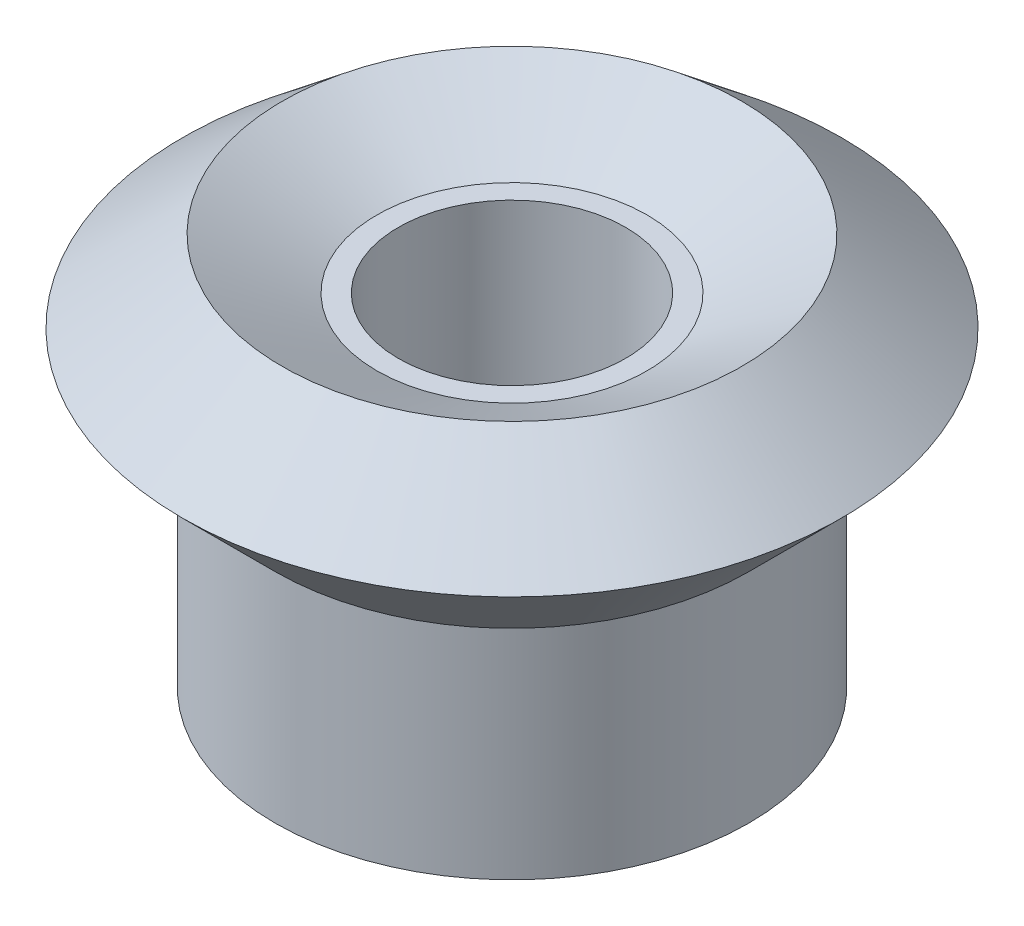
ISO-10303-21;
HEADER;
FILE_DESCRIPTION(('STEP AP214'),'2;1');
FILE_NAME('part.step','',(''),(''),'','','');
FILE_SCHEMA(('AUTOMOTIVE_DESIGN { 1 0 10303 214 1 1 1 1 }'));
ENDSEC;
DATA;
#1=APPLICATION_CONTEXT('core data for automotive mechanical design processes');
#2=APPLICATION_PROTOCOL_DEFINITION('international standard','automotive_design',2000,#1);
#3=PRODUCT_CONTEXT('',#1,'mechanical');
#4=PRODUCT('Part','Part','',(#3));
#5=PRODUCT_RELATED_PRODUCT_CATEGORY('part','',(#4));
#6=PRODUCT_DEFINITION_FORMATION('','',#4);
#7=PRODUCT_DEFINITION_CONTEXT('part definition',#1,'design');
#8=PRODUCT_DEFINITION('design','',#6,#7);
#9=PRODUCT_DEFINITION_SHAPE('','',#8);
#10=(LENGTH_UNIT() NAMED_UNIT(*) SI_UNIT(.MILLI.,.METRE.));
#11=(NAMED_UNIT(*) PLANE_ANGLE_UNIT() SI_UNIT($,.RADIAN.));
#12=(NAMED_UNIT(*) SI_UNIT($,.STERADIAN.) SOLID_ANGLE_UNIT());
#13=UNCERTAINTY_MEASURE_WITH_UNIT(LENGTH_MEASURE(1.E-05),#10,'distance_accuracy_value','');
#14=(GEOMETRIC_REPRESENTATION_CONTEXT(3) GLOBAL_UNCERTAINTY_ASSIGNED_CONTEXT((#13)) GLOBAL_UNIT_ASSIGNED_CONTEXT((#10,
#11,#12)) REPRESENTATION_CONTEXT('',''));
#15=CARTESIAN_POINT('',(0.,0.,0.));
#16=DIRECTION('',(0.,0.,1.));
#17=DIRECTION('',(1.,0.,0.));
#18=AXIS2_PLACEMENT_3D('',#15,#16,#17);
#19=CARTESIAN_POINT('',(0.,11.4999999999875,0.));
#20=DIRECTION('',(0.,1.,0.));
#21=DIRECTION('',(0.,0.,1.));
#22=AXIS2_PLACEMENT_3D('',#19,#20,#21);
#23=CONICAL_SURFACE('',#22,12.5000000000125,0.785398163397448);
#24=CARTESIAN_POINT('',(0.,16.3999999999875,0.));
#25=DIRECTION('',(0.,-1.,0.));
#26=DIRECTION('',(0.,0.,-1.));
#27=AXIS2_PLACEMENT_3D('',#24,#25,#26);
#28=CIRCLE('',#27,17.4000000000125);
#29=CARTESIAN_POINT('',(0.,16.3999999999875,-17.4000000000125));
#30=VERTEX_POINT('',#29);
#31=EDGE_CURVE('E10',#30,#30,#28,.T.);
#32=ORIENTED_EDGE('',*,*,#31,.T.);
#33=EDGE_LOOP('',(#32));
#34=FACE_BOUND('',#33,.T.);
#35=CARTESIAN_POINT('',(0.,11.4999999999875,0.));
#36=DIRECTION('',(0.,-1.,0.));
#37=DIRECTION('',(0.,0.,-1.));
#38=AXIS2_PLACEMENT_3D('',#35,#36,#37);
#39=CIRCLE('',#38,12.5000000000125);
#40=CARTESIAN_POINT('',(0.,11.4999999999875,-12.5000000000125));
#41=VERTEX_POINT('',#40);
#42=EDGE_CURVE('E51',#41,#41,#39,.T.);
#43=ORIENTED_EDGE('',*,*,#42,.F.);
#44=EDGE_LOOP('',(#43));
#45=FACE_BOUND('',#44,.T.);
#46=ADVANCED_FACE('F32',(#34,#45),#23,.T.);
#47=CARTESIAN_POINT('',(0.,16.3999999999875,0.));
#48=DIRECTION('',(0.,-1.,0.));
#49=DIRECTION('',(0.,0.,-1.));
#50=AXIS2_PLACEMENT_3D('',#47,#48,#49);
#51=CONICAL_SURFACE('',#50,17.4000000000125,0.886209572399739);
#52=CARTESIAN_POINT('',(0.,20.6999999997426,0.));
#53=DIRECTION('',(0.,-1.,0.));
#54=DIRECTION('',(0.,0.,-1.));
#55=AXIS2_PLACEMENT_3D('',#52,#53,#54);
#56=CIRCLE('',#55,12.1321729997899);
#57=CARTESIAN_POINT('',(0.,20.6999999997426,-12.1321729997899));
#58=VERTEX_POINT('',#57);
#59=EDGE_CURVE('E38',#58,#58,#56,.T.);
#60=ORIENTED_EDGE('',*,*,#59,.T.);
#61=EDGE_LOOP('',(#60));
#62=FACE_BOUND('',#61,.T.);
#63=ORIENTED_EDGE('',*,*,#31,.F.);
#64=EDGE_LOOP('',(#63));
#65=FACE_BOUND('',#64,.T.);
#66=ADVANCED_FACE('F81',(#62,#65),#51,.T.);
#67=CARTESIAN_POINT('',(0.,20.6999999997426,0.));
#68=DIRECTION('',(0.,1.,0.));
#69=DIRECTION('',(0.,0.,1.));
#70=AXIS2_PLACEMENT_3D('',#67,#68,#69);
#71=CONICAL_SURFACE('',#70,12.1321729997899,1.0756630633428);
#72=CARTESIAN_POINT('',(0.,18.,0.));
#73=DIRECTION('',(0.,-1.,0.));
#74=DIRECTION('',(0.,0.,-1.));
#75=AXIS2_PLACEMENT_3D('',#72,#73,#74);
#76=CIRCLE('',#75,7.13217300007154);
#77=CARTESIAN_POINT('',(0.,18.,-7.13217300007154));
#78=VERTEX_POINT('',#77);
#79=EDGE_CURVE('E42',#78,#78,#76,.T.);
#80=ORIENTED_EDGE('',*,*,#79,.T.);
#81=EDGE_LOOP('',(#80));
#82=FACE_BOUND('',#81,.T.);
#83=ORIENTED_EDGE('',*,*,#59,.F.);
#84=EDGE_LOOP('',(#83));
#85=FACE_BOUND('',#84,.T.);
#86=ADVANCED_FACE('F85',(#82,#85),#71,.F.);
#87=CARTESIAN_POINT('',(7.13217300007154,18.,0.));
#88=DIRECTION('',(0.,1.,0.));
#89=DIRECTION('',(0.,0.,1.));
#90=AXIS2_PLACEMENT_3D('',#87,#88,#89);
#91=PLANE('',#90);
#92=CARTESIAN_POINT('',(0.,18.,0.));
#93=DIRECTION('',(0.,1.,0.));
#94=DIRECTION('',(0.,0.,1.));
#95=AXIS2_PLACEMENT_3D('',#92,#93,#94);
#96=CIRCLE('',#95,6.);
#97=CARTESIAN_POINT('',(0.,18.,6.));
#98=VERTEX_POINT('',#97);
#99=EDGE_CURVE('E54',#98,#98,#96,.T.);
#100=ORIENTED_EDGE('',*,*,#99,.F.);
#101=EDGE_LOOP('',(#100));
#102=FACE_BOUND('',#101,.T.);
#103=ORIENTED_EDGE('',*,*,#79,.F.);
#104=EDGE_LOOP('',(#103));
#105=FACE_BOUND('',#104,.T.);
#106=ADVANCED_FACE('F67',(#102,#105),#91,.T.);
#107=CARTESIAN_POINT('',(5.,0.,0.));
#108=DIRECTION('',(0.,-1.,0.));
#109=DIRECTION('',(0.,0.,-1.));
#110=AXIS2_PLACEMENT_3D('',#107,#108,#109);
#111=PLANE('',#110);
#112=CARTESIAN_POINT('',(0.,0.,0.));
#113=DIRECTION('',(0.,-1.,0.));
#114=DIRECTION('',(0.,0.,-1.));
#115=AXIS2_PLACEMENT_3D('',#112,#113,#114);
#116=CIRCLE('',#115,6.);
#117=CARTESIAN_POINT('',(0.,0.,-6.));
#118=VERTEX_POINT('',#117);
#119=EDGE_CURVE('E57',#118,#118,#116,.T.);
#120=ORIENTED_EDGE('',*,*,#119,.F.);
#121=EDGE_LOOP('',(#120));
#122=FACE_BOUND('',#121,.T.);
#123=CARTESIAN_POINT('',(0.,0.,0.));
#124=DIRECTION('',(0.,-1.,0.));
#125=DIRECTION('',(0.,0.,-1.));
#126=AXIS2_PLACEMENT_3D('',#123,#124,#125);
#127=CIRCLE('',#126,12.5000000000125);
#128=CARTESIAN_POINT('',(0.,0.,-12.5000000000125));
#129=VERTEX_POINT('',#128);
#130=EDGE_CURVE('E46',#129,#129,#127,.T.);
#131=ORIENTED_EDGE('',*,*,#130,.T.);
#132=EDGE_LOOP('',(#131));
#133=FACE_BOUND('',#132,.T.);
#134=ADVANCED_FACE('F63',(#122,#133),#111,.T.);
#135=CARTESIAN_POINT('',(0.,20.6999999997426,0.));
#136=DIRECTION('',(0.,-1.,0.));
#137=DIRECTION('',(0.,0.,-1.));
#138=AXIS2_PLACEMENT_3D('',#135,#136,#137);
#139=CYLINDRICAL_SURFACE('',#138,12.5000000000125);
#140=ORIENTED_EDGE('',*,*,#42,.T.);
#141=EDGE_LOOP('',(#140));
#142=FACE_BOUND('',#141,.T.);
#143=ORIENTED_EDGE('',*,*,#130,.F.);
#144=EDGE_LOOP('',(#143));
#145=FACE_BOUND('',#144,.T.);
#146=ADVANCED_FACE('F66',(#142,#145),#139,.T.);
#147=CARTESIAN_POINT('',(0.,20.6999999997426,0.));
#148=DIRECTION('',(0.,-1.,0.));
#149=DIRECTION('',(0.,0.,-1.));
#150=AXIS2_PLACEMENT_3D('',#147,#148,#149);
#151=CYLINDRICAL_SURFACE('',#150,6.);
#152=ORIENTED_EDGE('',*,*,#99,.T.);
#153=EDGE_LOOP('',(#152));
#154=FACE_BOUND('',#153,.T.);
#155=ORIENTED_EDGE('',*,*,#119,.T.);
#156=EDGE_LOOP('',(#155));
#157=FACE_BOUND('',#156,.T.);
#158=ADVANCED_FACE('F61',(#154,#157),#151,.F.);
#159=CLOSED_SHELL('',(#46,#66,#86,#106,#134,#146,#158));
#160=MANIFOLD_SOLID_BREP('B2',#159);
#161=ADVANCED_BREP_SHAPE_REPRESENTATION('',(#18,#160),#14);
#162=SHAPE_DEFINITION_REPRESENTATION(#9,#161);
ENDSEC;
END-ISO-10303-21;
